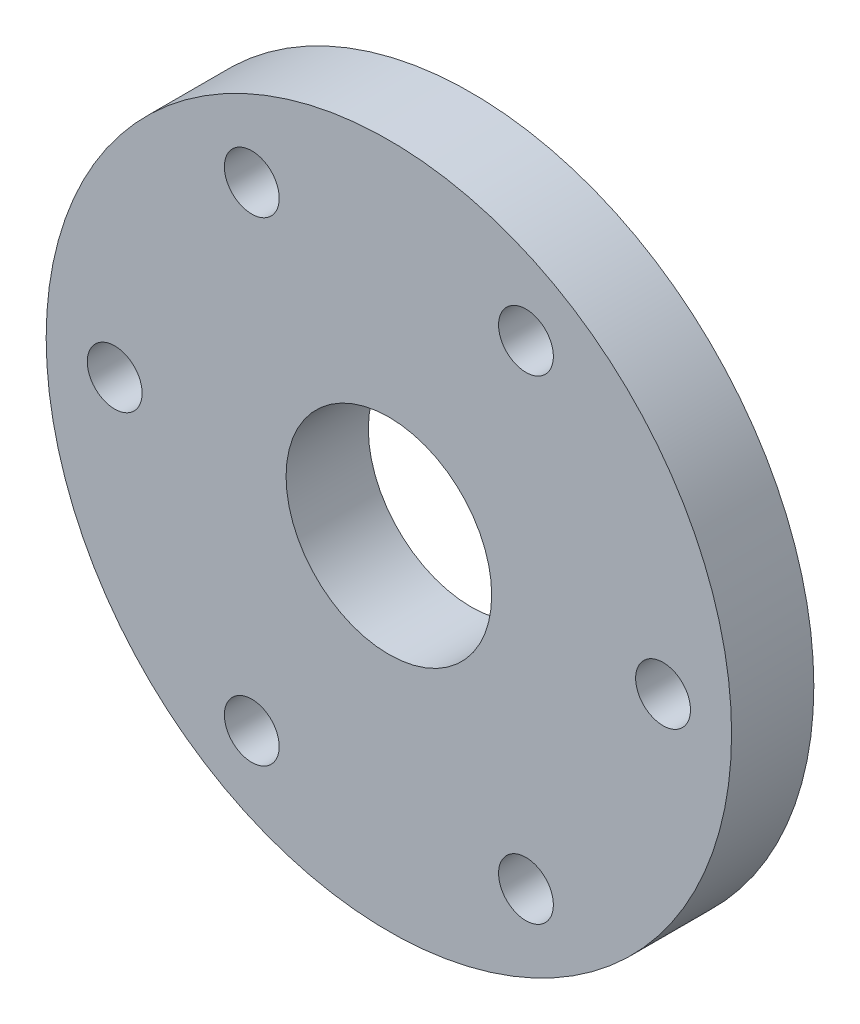
ISO-10303-21;
HEADER;
FILE_DESCRIPTION(('STEP AP214'),'2;1');
FILE_NAME('part.step','',(''),(''),'','','');
FILE_SCHEMA(('AUTOMOTIVE_DESIGN { 1 0 10303 214 1 1 1 1 }'));
ENDSEC;
DATA;
#1=APPLICATION_CONTEXT('core data for automotive mechanical design processes');
#2=APPLICATION_PROTOCOL_DEFINITION('international standard','automotive_design',2000,#1);
#3=PRODUCT_CONTEXT('',#1,'mechanical');
#4=PRODUCT('Part','Part','',(#3));
#5=PRODUCT_RELATED_PRODUCT_CATEGORY('part','',(#4));
#6=PRODUCT_DEFINITION_FORMATION('','',#4);
#7=PRODUCT_DEFINITION_CONTEXT('part definition',#1,'design');
#8=PRODUCT_DEFINITION('design','',#6,#7);
#9=PRODUCT_DEFINITION_SHAPE('','',#8);
#10=(LENGTH_UNIT() NAMED_UNIT(*) SI_UNIT(.MILLI.,.METRE.));
#11=(NAMED_UNIT(*) PLANE_ANGLE_UNIT() SI_UNIT($,.RADIAN.));
#12=(NAMED_UNIT(*) SI_UNIT($,.STERADIAN.) SOLID_ANGLE_UNIT());
#13=UNCERTAINTY_MEASURE_WITH_UNIT(LENGTH_MEASURE(1.E-05),#10,'distance_accuracy_value','');
#14=(GEOMETRIC_REPRESENTATION_CONTEXT(3) GLOBAL_UNCERTAINTY_ASSIGNED_CONTEXT((#13)) GLOBAL_UNIT_ASSIGNED_CONTEXT((#10,
#11,#12)) REPRESENTATION_CONTEXT('',''));
#15=CARTESIAN_POINT('',(0.,0.,0.));
#16=DIRECTION('',(0.,0.,1.));
#17=DIRECTION('',(1.,0.,0.));
#18=AXIS2_PLACEMENT_3D('',#15,#16,#17);
#19=CARTESIAN_POINT('',(0.,0.,12.));
#20=DIRECTION('',(0.,0.,1.));
#21=DIRECTION('',(1.,0.,0.));
#22=AXIS2_PLACEMENT_3D('',#19,#20,#21);
#23=PLANE('',#22);
#24=CARTESIAN_POINT('',(40.,0.,12.));
#25=DIRECTION('',(0.,0.,1.));
#26=DIRECTION('',(1.,0.,0.));
#27=AXIS2_PLACEMENT_3D('',#24,#25,#26);
#28=CIRCLE('',#27,4.);
#29=CARTESIAN_POINT('',(44.,0.,12.));
#30=VERTEX_POINT('',#29);
#31=EDGE_CURVE('E71',#30,#30,#28,.T.);
#32=ORIENTED_EDGE('',*,*,#31,.F.);
#33=EDGE_LOOP('',(#32));
#34=FACE_BOUND('',#33,.T.);
#35=CARTESIAN_POINT('',(20.,-34.641016,12.));
#36=DIRECTION('',(0.,0.,1.));
#37=DIRECTION('',(1.,0.,0.));
#38=AXIS2_PLACEMENT_3D('',#35,#36,#37);
#39=CIRCLE('',#38,4.);
#40=CARTESIAN_POINT('',(24.,-34.641016,12.));
#41=VERTEX_POINT('',#40);
#42=EDGE_CURVE('E107',#41,#41,#39,.T.);
#43=ORIENTED_EDGE('',*,*,#42,.F.);
#44=EDGE_LOOP('',(#43));
#45=FACE_BOUND('',#44,.T.);
#46=CARTESIAN_POINT('',(-20.,-34.641016,12.));
#47=DIRECTION('',(0.,0.,1.));
#48=DIRECTION('',(1.,0.,0.));
#49=AXIS2_PLACEMENT_3D('',#46,#47,#48);
#50=CIRCLE('',#49,4.);
#51=CARTESIAN_POINT('',(-16.,-34.641016,12.));
#52=VERTEX_POINT('',#51);
#53=EDGE_CURVE('E75',#52,#52,#50,.T.);
#54=ORIENTED_EDGE('',*,*,#53,.F.);
#55=EDGE_LOOP('',(#54));
#56=FACE_BOUND('',#55,.T.);
#57=CARTESIAN_POINT('',(-40.,0.,12.));
#58=DIRECTION('',(0.,0.,1.));
#59=DIRECTION('',(1.,0.,0.));
#60=AXIS2_PLACEMENT_3D('',#57,#58,#59);
#61=CIRCLE('',#60,4.);
#62=CARTESIAN_POINT('',(-36.,0.,12.));
#63=VERTEX_POINT('',#62);
#64=EDGE_CURVE('E84',#63,#63,#61,.T.);
#65=ORIENTED_EDGE('',*,*,#64,.F.);
#66=EDGE_LOOP('',(#65));
#67=FACE_BOUND('',#66,.T.);
#68=CARTESIAN_POINT('',(-20.,34.641016,12.));
#69=DIRECTION('',(0.,0.,1.));
#70=DIRECTION('',(1.,0.,0.));
#71=AXIS2_PLACEMENT_3D('',#68,#69,#70);
#72=CIRCLE('',#71,4.);
#73=CARTESIAN_POINT('',(-16.,34.641016,12.));
#74=VERTEX_POINT('',#73);
#75=EDGE_CURVE('E91',#74,#74,#72,.T.);
#76=ORIENTED_EDGE('',*,*,#75,.F.);
#77=EDGE_LOOP('',(#76));
#78=FACE_BOUND('',#77,.T.);
#79=CARTESIAN_POINT('',(20.,34.641016,12.));
#80=DIRECTION('',(0.,0.,1.));
#81=DIRECTION('',(1.,0.,0.));
#82=AXIS2_PLACEMENT_3D('',#79,#80,#81);
#83=CIRCLE('',#82,4.);
#84=CARTESIAN_POINT('',(24.,34.641016,12.));
#85=VERTEX_POINT('',#84);
#86=EDGE_CURVE('E99',#85,#85,#83,.T.);
#87=ORIENTED_EDGE('',*,*,#86,.F.);
#88=EDGE_LOOP('',(#87));
#89=FACE_BOUND('',#88,.T.);
#90=CARTESIAN_POINT('',(0.,0.,12.));
#91=DIRECTION('',(0.,0.,1.));
#92=DIRECTION('',(1.,0.,0.));
#93=AXIS2_PLACEMENT_3D('',#90,#91,#92);
#94=CIRCLE('',#93,50.);
#95=CARTESIAN_POINT('',(50.,0.,12.));
#96=VERTEX_POINT('',#95);
#97=EDGE_CURVE('E10',#96,#96,#94,.T.);
#98=ORIENTED_EDGE('',*,*,#97,.T.);
#99=EDGE_LOOP('',(#98));
#100=FACE_BOUND('',#99,.T.);
#101=CARTESIAN_POINT('',(0.,0.,12.));
#102=DIRECTION('',(0.,0.,1.));
#103=DIRECTION('',(1.,0.,0.));
#104=AXIS2_PLACEMENT_3D('',#101,#102,#103);
#105=CIRCLE('',#104,15.);
#106=CARTESIAN_POINT('',(15.,0.,12.));
#107=VERTEX_POINT('',#106);
#108=EDGE_CURVE('E65',#107,#107,#105,.T.);
#109=ORIENTED_EDGE('',*,*,#108,.F.);
#110=EDGE_LOOP('',(#109));
#111=FACE_BOUND('',#110,.T.);
#112=ADVANCED_FACE('F49',(#34,#45,#56,#67,#78,#89,#100,#111),#23,.T.);
#113=CARTESIAN_POINT('',(0.,0.,0.));
#114=DIRECTION('',(0.,0.,1.));
#115=DIRECTION('',(1.,0.,0.));
#116=AXIS2_PLACEMENT_3D('',#113,#114,#115);
#117=PLANE('',#116);
#118=CARTESIAN_POINT('',(40.,0.,0.));
#119=DIRECTION('',(0.,0.,1.));
#120=DIRECTION('',(1.,0.,0.));
#121=AXIS2_PLACEMENT_3D('',#118,#119,#120);
#122=CIRCLE('',#121,4.);
#123=CARTESIAN_POINT('',(44.,0.,0.));
#124=VERTEX_POINT('',#123);
#125=EDGE_CURVE('E106',#124,#124,#122,.T.);
#126=ORIENTED_EDGE('',*,*,#125,.T.);
#127=EDGE_LOOP('',(#126));
#128=FACE_BOUND('',#127,.T.);
#129=CARTESIAN_POINT('',(20.,-34.641016,0.));
#130=DIRECTION('',(0.,0.,1.));
#131=DIRECTION('',(1.,0.,0.));
#132=AXIS2_PLACEMENT_3D('',#129,#130,#131);
#133=CIRCLE('',#132,4.);
#134=CARTESIAN_POINT('',(24.,-34.641016,0.));
#135=VERTEX_POINT('',#134);
#136=EDGE_CURVE('E80',#135,#135,#133,.T.);
#137=ORIENTED_EDGE('',*,*,#136,.T.);
#138=EDGE_LOOP('',(#137));
#139=FACE_BOUND('',#138,.T.);
#140=CARTESIAN_POINT('',(-20.,-34.641016,0.));
#141=DIRECTION('',(0.,0.,1.));
#142=DIRECTION('',(1.,0.,0.));
#143=AXIS2_PLACEMENT_3D('',#140,#141,#142);
#144=CIRCLE('',#143,4.);
#145=CARTESIAN_POINT('',(-16.,-34.641016,0.));
#146=VERTEX_POINT('',#145);
#147=EDGE_CURVE('E79',#146,#146,#144,.T.);
#148=ORIENTED_EDGE('',*,*,#147,.T.);
#149=EDGE_LOOP('',(#148));
#150=FACE_BOUND('',#149,.T.);
#151=CARTESIAN_POINT('',(-40.,0.,0.));
#152=DIRECTION('',(0.,0.,1.));
#153=DIRECTION('',(1.,0.,0.));
#154=AXIS2_PLACEMENT_3D('',#151,#152,#153);
#155=CIRCLE('',#154,4.);
#156=CARTESIAN_POINT('',(-36.,0.,0.));
#157=VERTEX_POINT('',#156);
#158=EDGE_CURVE('E88',#157,#157,#155,.T.);
#159=ORIENTED_EDGE('',*,*,#158,.T.);
#160=EDGE_LOOP('',(#159));
#161=FACE_BOUND('',#160,.T.);
#162=CARTESIAN_POINT('',(-20.,34.641016,0.));
#163=DIRECTION('',(0.,0.,1.));
#164=DIRECTION('',(1.,0.,0.));
#165=AXIS2_PLACEMENT_3D('',#162,#163,#164);
#166=CIRCLE('',#165,4.);
#167=CARTESIAN_POINT('',(-16.,34.641016,0.));
#168=VERTEX_POINT('',#167);
#169=EDGE_CURVE('E95',#168,#168,#166,.T.);
#170=ORIENTED_EDGE('',*,*,#169,.T.);
#171=EDGE_LOOP('',(#170));
#172=FACE_BOUND('',#171,.T.);
#173=CARTESIAN_POINT('',(20.,34.641016,0.));
#174=DIRECTION('',(0.,0.,1.));
#175=DIRECTION('',(1.,0.,0.));
#176=AXIS2_PLACEMENT_3D('',#173,#174,#175);
#177=CIRCLE('',#176,4.);
#178=CARTESIAN_POINT('',(24.,34.641016,0.));
#179=VERTEX_POINT('',#178);
#180=EDGE_CURVE('E102',#179,#179,#177,.T.);
#181=ORIENTED_EDGE('',*,*,#180,.T.);
#182=EDGE_LOOP('',(#181));
#183=FACE_BOUND('',#182,.T.);
#184=CARTESIAN_POINT('',(0.,0.,0.));
#185=DIRECTION('',(0.,0.,1.));
#186=DIRECTION('',(1.,0.,0.));
#187=AXIS2_PLACEMENT_3D('',#184,#185,#186);
#188=CIRCLE('',#187,50.);
#189=CARTESIAN_POINT('',(50.,0.,0.));
#190=VERTEX_POINT('',#189);
#191=EDGE_CURVE('E54',#190,#190,#188,.T.);
#192=ORIENTED_EDGE('',*,*,#191,.F.);
#193=EDGE_LOOP('',(#192));
#194=FACE_BOUND('',#193,.T.);
#195=CARTESIAN_POINT('',(0.,0.,0.));
#196=DIRECTION('',(0.,0.,1.));
#197=DIRECTION('',(1.,0.,0.));
#198=AXIS2_PLACEMENT_3D('',#195,#196,#197);
#199=CIRCLE('',#198,15.);
#200=CARTESIAN_POINT('',(15.,0.,0.));
#201=VERTEX_POINT('',#200);
#202=EDGE_CURVE('E67',#201,#201,#199,.T.);
#203=ORIENTED_EDGE('',*,*,#202,.T.);
#204=EDGE_LOOP('',(#203));
#205=FACE_BOUND('',#204,.T.);
#206=ADVANCED_FACE('F126',(#128,#139,#150,#161,#172,#183,#194,#205),#117,.F.);
#207=CARTESIAN_POINT('',(0.,0.,12.));
#208=DIRECTION('',(0.,0.,-1.));
#209=DIRECTION('',(-1.,0.,0.));
#210=AXIS2_PLACEMENT_3D('',#207,#208,#209);
#211=CYLINDRICAL_SURFACE('',#210,50.);
#212=ORIENTED_EDGE('',*,*,#97,.F.);
#213=EDGE_LOOP('',(#212));
#214=FACE_BOUND('',#213,.T.);
#215=ORIENTED_EDGE('',*,*,#191,.T.);
#216=EDGE_LOOP('',(#215));
#217=FACE_BOUND('',#216,.T.);
#218=ADVANCED_FACE('F52',(#214,#217),#211,.T.);
#219=CARTESIAN_POINT('',(0.,0.,12.));
#220=DIRECTION('',(0.,0.,-1.));
#221=DIRECTION('',(-1.,0.,0.));
#222=AXIS2_PLACEMENT_3D('',#219,#220,#221);
#223=CYLINDRICAL_SURFACE('',#222,15.);
#224=ORIENTED_EDGE('',*,*,#108,.T.);
#225=EDGE_LOOP('',(#224));
#226=FACE_BOUND('',#225,.T.);
#227=ORIENTED_EDGE('',*,*,#202,.F.);
#228=EDGE_LOOP('',(#227));
#229=FACE_BOUND('',#228,.T.);
#230=ADVANCED_FACE('F140',(#226,#229),#223,.F.);
#231=CARTESIAN_POINT('',(20.,34.641016,12.));
#232=DIRECTION('',(0.,0.,-1.));
#233=DIRECTION('',(-1.,0.,0.));
#234=AXIS2_PLACEMENT_3D('',#231,#232,#233);
#235=CYLINDRICAL_SURFACE('',#234,4.);
#236=ORIENTED_EDGE('',*,*,#86,.T.);
#237=EDGE_LOOP('',(#236));
#238=FACE_BOUND('',#237,.T.);
#239=ORIENTED_EDGE('',*,*,#180,.F.);
#240=EDGE_LOOP('',(#239));
#241=FACE_BOUND('',#240,.T.);
#242=ADVANCED_FACE('F143',(#238,#241),#235,.F.);
#243=CARTESIAN_POINT('',(-20.,34.641016,12.));
#244=DIRECTION('',(0.,0.,-1.));
#245=DIRECTION('',(-1.,0.,0.));
#246=AXIS2_PLACEMENT_3D('',#243,#244,#245);
#247=CYLINDRICAL_SURFACE('',#246,4.);
#248=ORIENTED_EDGE('',*,*,#75,.T.);
#249=EDGE_LOOP('',(#248));
#250=FACE_BOUND('',#249,.T.);
#251=ORIENTED_EDGE('',*,*,#169,.F.);
#252=EDGE_LOOP('',(#251));
#253=FACE_BOUND('',#252,.T.);
#254=ADVANCED_FACE('F171',(#250,#253),#247,.F.);
#255=CARTESIAN_POINT('',(-40.,0.,12.));
#256=DIRECTION('',(0.,0.,-1.));
#257=DIRECTION('',(-1.,0.,0.));
#258=AXIS2_PLACEMENT_3D('',#255,#256,#257);
#259=CYLINDRICAL_SURFACE('',#258,4.);
#260=ORIENTED_EDGE('',*,*,#64,.T.);
#261=EDGE_LOOP('',(#260));
#262=FACE_BOUND('',#261,.T.);
#263=ORIENTED_EDGE('',*,*,#158,.F.);
#264=EDGE_LOOP('',(#263));
#265=FACE_BOUND('',#264,.T.);
#266=ADVANCED_FACE('F166',(#262,#265),#259,.F.);
#267=CARTESIAN_POINT('',(-20.,-34.641016,12.));
#268=DIRECTION('',(0.,0.,-1.));
#269=DIRECTION('',(-1.,0.,0.));
#270=AXIS2_PLACEMENT_3D('',#267,#268,#269);
#271=CYLINDRICAL_SURFACE('',#270,4.);
#272=ORIENTED_EDGE('',*,*,#53,.T.);
#273=EDGE_LOOP('',(#272));
#274=FACE_BOUND('',#273,.T.);
#275=ORIENTED_EDGE('',*,*,#147,.F.);
#276=EDGE_LOOP('',(#275));
#277=FACE_BOUND('',#276,.T.);
#278=ADVANCED_FACE('F160',(#274,#277),#271,.F.);
#279=CARTESIAN_POINT('',(20.,-34.641016,12.));
#280=DIRECTION('',(0.,0.,-1.));
#281=DIRECTION('',(-1.,0.,0.));
#282=AXIS2_PLACEMENT_3D('',#279,#280,#281);
#283=CYLINDRICAL_SURFACE('',#282,4.);
#284=ORIENTED_EDGE('',*,*,#42,.T.);
#285=EDGE_LOOP('',(#284));
#286=FACE_BOUND('',#285,.T.);
#287=ORIENTED_EDGE('',*,*,#136,.F.);
#288=EDGE_LOOP('',(#287));
#289=FACE_BOUND('',#288,.T.);
#290=ADVANCED_FACE('F165',(#286,#289),#283,.F.);
#291=CARTESIAN_POINT('',(40.,0.,12.));
#292=DIRECTION('',(0.,0.,-1.));
#293=DIRECTION('',(-1.,0.,0.));
#294=AXIS2_PLACEMENT_3D('',#291,#292,#293);
#295=CYLINDRICAL_SURFACE('',#294,4.);
#296=ORIENTED_EDGE('',*,*,#31,.T.);
#297=EDGE_LOOP('',(#296));
#298=FACE_BOUND('',#297,.T.);
#299=ORIENTED_EDGE('',*,*,#125,.F.);
#300=EDGE_LOOP('',(#299));
#301=FACE_BOUND('',#300,.T.);
#302=ADVANCED_FACE('F121',(#298,#301),#295,.F.);
#303=CLOSED_SHELL('',(#112,#206,#218,#230,#242,#254,#266,#278,#290,#302));
#304=MANIFOLD_SOLID_BREP('B2',#303);
#305=ADVANCED_BREP_SHAPE_REPRESENTATION('',(#18,#304),#14);
#306=SHAPE_DEFINITION_REPRESENTATION(#9,#305);
ENDSEC;
END-ISO-10303-21;
